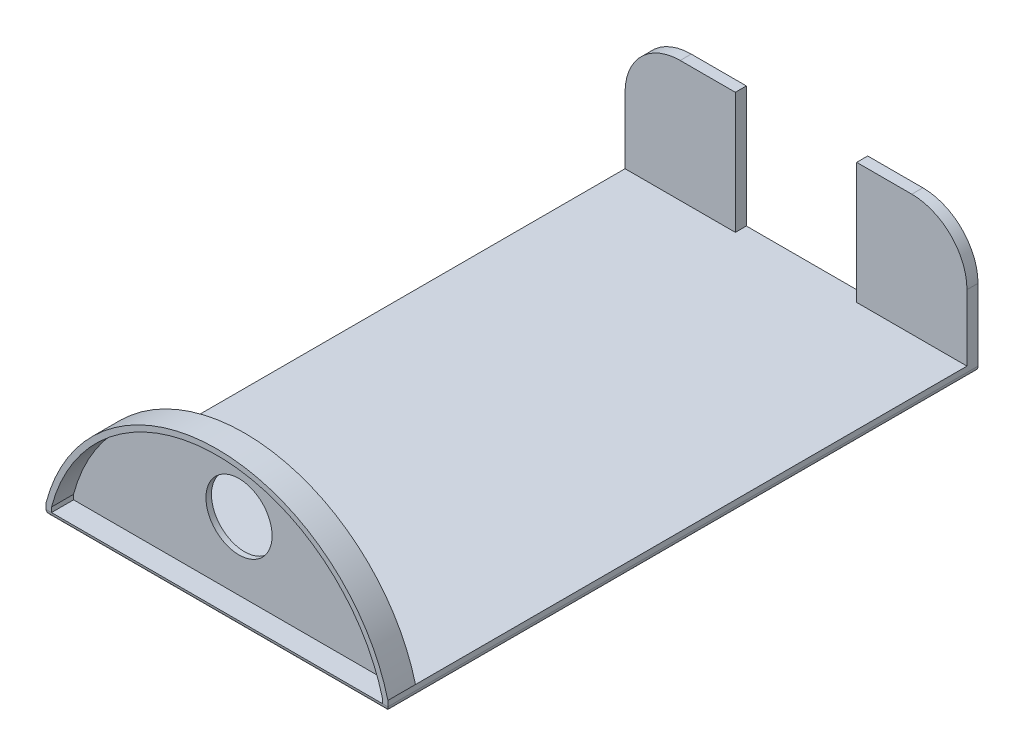
ISO-10303-21;
HEADER;
FILE_DESCRIPTION(('STEP AP214'),'2;1');
FILE_NAME('part.step','',(''),(''),'','','');
FILE_SCHEMA(('AUTOMOTIVE_DESIGN { 1 0 10303 214 1 1 1 1 }'));
ENDSEC;
DATA;
#1=APPLICATION_CONTEXT('core data for automotive mechanical design processes');
#2=APPLICATION_PROTOCOL_DEFINITION('international standard','automotive_design',2000,#1);
#3=PRODUCT_CONTEXT('',#1,'mechanical');
#4=PRODUCT('Part','Part','',(#3));
#5=PRODUCT_RELATED_PRODUCT_CATEGORY('part','',(#4));
#6=PRODUCT_DEFINITION_FORMATION('','',#4);
#7=PRODUCT_DEFINITION_CONTEXT('part definition',#1,'design');
#8=PRODUCT_DEFINITION('design','',#6,#7);
#9=PRODUCT_DEFINITION_SHAPE('','',#8);
#10=(LENGTH_UNIT() NAMED_UNIT(*) SI_UNIT(.MILLI.,.METRE.));
#11=(NAMED_UNIT(*) PLANE_ANGLE_UNIT() SI_UNIT($,.RADIAN.));
#12=(NAMED_UNIT(*) SI_UNIT($,.STERADIAN.) SOLID_ANGLE_UNIT());
#13=UNCERTAINTY_MEASURE_WITH_UNIT(LENGTH_MEASURE(1.E-05),#10,'distance_accuracy_value','');
#14=(GEOMETRIC_REPRESENTATION_CONTEXT(3) GLOBAL_UNCERTAINTY_ASSIGNED_CONTEXT((#13)) GLOBAL_UNIT_ASSIGNED_CONTEXT((#10,
#11,#12)) REPRESENTATION_CONTEXT('',''));
#15=CARTESIAN_POINT('',(0.,0.,0.));
#16=DIRECTION('',(0.,0.,1.));
#17=DIRECTION('',(1.,0.,0.));
#18=AXIS2_PLACEMENT_3D('',#15,#16,#17);
#19=CARTESIAN_POINT('',(31.,-6.02353153407739,107.));
#20=DIRECTION('',(0.,0.,-1.));
#21=DIRECTION('',(-1.,0.,0.));
#22=AXIS2_PLACEMENT_3D('',#19,#20,#21);
#23=PLANE('',#22);
#24=DIRECTION('',(0.,-1.,0.));
#25=VECTOR('',#24,1.);
#26=CARTESIAN_POINT('',(0.,2.,107.));
#27=LINE('',#26,#25);
#28=CARTESIAN_POINT('',(0.,2.,107.));
#29=VERTEX_POINT('',#28);
#30=CARTESIAN_POINT('',(0.,1.,107.));
#31=VERTEX_POINT('',#30);
#32=EDGE_CURVE('E212',#29,#31,#27,.T.);
#33=ORIENTED_EDGE('',*,*,#32,.T.);
#34=DIRECTION('',(1.,0.,0.));
#35=VECTOR('',#34,1.);
#36=CARTESIAN_POINT('',(31.,0.999999999999999,107.));
#37=LINE('',#36,#35);
#38=CARTESIAN_POINT('',(1.,1.,107.));
#39=VERTEX_POINT('',#38);
#40=EDGE_CURVE('E283',#31,#39,#37,.T.);
#41=ORIENTED_EDGE('',*,*,#40,.T.);
#42=DIRECTION('',(0.,-1.,0.));
#43=VECTOR('',#42,1.);
#44=CARTESIAN_POINT('',(1.,-6.02353153407739,107.));
#45=LINE('',#44,#43);
#46=CARTESIAN_POINT('',(1.,1.87165938603069,107.));
#47=VERTEX_POINT('',#46);
#48=EDGE_CURVE('E206',#47,#39,#45,.T.);
#49=ORIENTED_EDGE('',*,*,#48,.F.);
#50=CARTESIAN_POINT('',(31.,-6.02353153407739,107.));
#51=DIRECTION('',(0.,0.,-1.));
#52=DIRECTION('',(-1.,0.,0.));
#53=AXIS2_PLACEMENT_3D('',#50,#51,#52);
#54=CIRCLE('',#53,31.0215093066884);
#55=CARTESIAN_POINT('',(61.,1.87165938603069,107.));
#56=VERTEX_POINT('',#55);
#57=EDGE_CURVE('E173',#56,#47,#54,.F.);
#58=ORIENTED_EDGE('',*,*,#57,.F.);
#59=DIRECTION('',(0.,1.,0.));
#60=VECTOR('',#59,1.);
#61=CARTESIAN_POINT('',(61.,-6.02353153407739,107.));
#62=LINE('',#61,#60);
#63=CARTESIAN_POINT('',(61.,0.999999999999998,107.));
#64=VERTEX_POINT('',#63);
#65=EDGE_CURVE('E202',#64,#56,#62,.T.);
#66=ORIENTED_EDGE('',*,*,#65,.F.);
#67=DIRECTION('',(1.,0.,0.));
#68=VECTOR('',#67,1.);
#69=CARTESIAN_POINT('',(31.,0.999999999999999,107.));
#70=LINE('',#69,#68);
#71=CARTESIAN_POINT('',(62.,0.999999999999997,107.));
#72=VERTEX_POINT('',#71);
#73=EDGE_CURVE('E281',#64,#72,#70,.T.);
#74=ORIENTED_EDGE('',*,*,#73,.T.);
#75=DIRECTION('',(0.,1.,0.));
#76=VECTOR('',#75,1.);
#77=CARTESIAN_POINT('',(62.,0.,107.));
#78=LINE('',#77,#76);
#79=CARTESIAN_POINT('',(62.,2.,107.));
#80=VERTEX_POINT('',#79);
#81=EDGE_CURVE('E215',#72,#80,#78,.T.);
#82=ORIENTED_EDGE('',*,*,#81,.T.);
#83=CARTESIAN_POINT('',(31.,-6.02353153407739,107.));
#84=DIRECTION('',(0.,0.,1.));
#85=DIRECTION('',(-1.,0.,0.));
#86=AXIS2_PLACEMENT_3D('',#83,#84,#85);
#87=CIRCLE('',#86,32.0215093066884);
#88=EDGE_CURVE('E209',#80,#29,#87,.T.);
#89=ORIENTED_EDGE('',*,*,#88,.T.);
#90=EDGE_LOOP('',(#33,#41,#49,#58,#66,#74,#82,#89));
#91=FACE_BOUND('',#90,.T.);
#92=ADVANCED_FACE('F36',(#91),#23,.F.);
#93=CARTESIAN_POINT('',(0.,0.,2.));
#94=DIRECTION('',(0.,0.,-1.));
#95=DIRECTION('',(-1.,0.,0.));
#96=AXIS2_PLACEMENT_3D('',#93,#94,#95);
#97=PLANE('',#96);
#98=DIRECTION('',(0.,1.,0.));
#99=VECTOR('',#98,1.);
#100=CARTESIAN_POINT('',(62.,24.,2.));
#101=LINE('',#100,#99);
#102=CARTESIAN_POINT('',(62.,2.00000000000001,2.));
#103=VERTEX_POINT('',#102);
#104=CARTESIAN_POINT('',(62.,14.,2.));
#105=VERTEX_POINT('',#104);
#106=EDGE_CURVE('E239',#103,#105,#101,.T.);
#107=ORIENTED_EDGE('',*,*,#106,.T.);
#108=CARTESIAN_POINT('',(52.,14.,2.));
#109=DIRECTION('',(0.,0.,-1.));
#110=DIRECTION('',(-1.,0.,0.));
#111=AXIS2_PLACEMENT_3D('',#108,#109,#110);
#112=CIRCLE('',#111,10.);
#113=CARTESIAN_POINT('',(52.,24.,2.));
#114=VERTEX_POINT('',#113);
#115=EDGE_CURVE('E11',#105,#114,#112,.F.);
#116=ORIENTED_EDGE('',*,*,#115,.T.);
#117=DIRECTION('',(-1.,0.,0.));
#118=VECTOR('',#117,1.);
#119=CARTESIAN_POINT('',(42.,24.,2.));
#120=LINE('',#119,#118);
#121=CARTESIAN_POINT('',(42.,24.,2.));
#122=VERTEX_POINT('',#121);
#123=EDGE_CURVE('E241',#114,#122,#120,.T.);
#124=ORIENTED_EDGE('',*,*,#123,.T.);
#125=DIRECTION('',(0.,-1.,0.));
#126=VECTOR('',#125,1.);
#127=CARTESIAN_POINT('',(42.,2.,2.));
#128=LINE('',#127,#126);
#129=CARTESIAN_POINT('',(42.,2.,2.));
#130=VERTEX_POINT('',#129);
#131=EDGE_CURVE('E244',#122,#130,#128,.T.);
#132=ORIENTED_EDGE('',*,*,#131,.T.);
#133=DIRECTION('',(-1.,0.,0.));
#134=VECTOR('',#133,1.);
#135=CARTESIAN_POINT('',(0.,2.,2.));
#136=LINE('',#135,#134);
#137=EDGE_CURVE('E225',#103,#130,#136,.T.);
#138=ORIENTED_EDGE('',*,*,#137,.F.);
#139=EDGE_LOOP('',(#107,#116,#124,#132,#138));
#140=FACE_BOUND('',#139,.T.);
#141=ADVANCED_FACE('F342',(#140),#97,.F.);
#142=DIRECTION('',(-1.,0.,0.));
#143=VECTOR('',#142,1.);
#144=CARTESIAN_POINT('',(0.,24.,2.));
#145=LINE('',#144,#143);
#146=CARTESIAN_POINT('',(20.,24.,2.));
#147=VERTEX_POINT('',#146);
#148=CARTESIAN_POINT('',(10.,24.,2.));
#149=VERTEX_POINT('',#148);
#150=EDGE_CURVE('E248',#147,#149,#145,.T.);
#151=ORIENTED_EDGE('',*,*,#150,.T.);
#152=CARTESIAN_POINT('',(10.,14.,2.));
#153=DIRECTION('',(0.,0.,-1.));
#154=DIRECTION('',(-1.,0.,0.));
#155=AXIS2_PLACEMENT_3D('',#152,#153,#154);
#156=CIRCLE('',#155,10.);
#157=CARTESIAN_POINT('',(0.,14.,2.));
#158=VERTEX_POINT('',#157);
#159=EDGE_CURVE('E317',#149,#158,#156,.F.);
#160=ORIENTED_EDGE('',*,*,#159,.T.);
#161=DIRECTION('',(0.,-1.,0.));
#162=VECTOR('',#161,1.);
#163=CARTESIAN_POINT('',(0.,0.,2.));
#164=LINE('',#163,#162);
#165=CARTESIAN_POINT('',(0.,2.,2.));
#166=VERTEX_POINT('',#165);
#167=EDGE_CURVE('E251',#158,#166,#164,.T.);
#168=ORIENTED_EDGE('',*,*,#167,.T.);
#169=CARTESIAN_POINT('',(20.,2.,2.));
#170=VERTEX_POINT('',#169);
#171=EDGE_CURVE('E232',#170,#166,#136,.T.);
#172=ORIENTED_EDGE('',*,*,#171,.F.);
#173=DIRECTION('',(0.,1.,0.));
#174=VECTOR('',#173,1.);
#175=CARTESIAN_POINT('',(20.,24.,2.));
#176=LINE('',#175,#174);
#177=EDGE_CURVE('E246',#170,#147,#176,.T.);
#178=ORIENTED_EDGE('',*,*,#177,.T.);
#179=EDGE_LOOP('',(#151,#160,#168,#172,#178));
#180=FACE_BOUND('',#179,.T.);
#181=ADVANCED_FACE('F376',(#180),#97,.F.);
#182=CARTESIAN_POINT('',(62.,0.,2.));
#183=DIRECTION('',(0.,1.,0.));
#184=DIRECTION('',(-1.,0.,0.));
#185=AXIS2_PLACEMENT_3D('',#182,#183,#184);
#186=PLANE('',#185);
#187=DIRECTION('',(1.,0.,0.));
#188=VECTOR('',#187,1.);
#189=CARTESIAN_POINT('',(62.,0.,0.));
#190=LINE('',#189,#188);
#191=CARTESIAN_POINT('',(1.,0.,0.));
#192=VERTEX_POINT('',#191);
#193=CARTESIAN_POINT('',(61.,0.,0.));
#194=VERTEX_POINT('',#193);
#195=EDGE_CURVE('E238',#192,#194,#190,.T.);
#196=ORIENTED_EDGE('',*,*,#195,.T.);
#197=DIRECTION('',(0.,0.,-1.));
#198=VECTOR('',#197,1.);
#199=CARTESIAN_POINT('',(61.,0.,2.));
#200=LINE('',#199,#198);
#201=CARTESIAN_POINT('',(61.,0.,106.));
#202=VERTEX_POINT('',#201);
#203=EDGE_CURVE('E290',#194,#202,#200,.F.);
#204=ORIENTED_EDGE('',*,*,#203,.T.);
#205=DIRECTION('',(1.,0.,0.));
#206=VECTOR('',#205,1.);
#207=CARTESIAN_POINT('',(62.,0.,106.));
#208=LINE('',#207,#206);
#209=CARTESIAN_POINT('',(1.,0.,106.));
#210=VERTEX_POINT('',#209);
#211=EDGE_CURVE('E288',#202,#210,#208,.F.);
#212=ORIENTED_EDGE('',*,*,#211,.T.);
#213=DIRECTION('',(0.,0.,-1.));
#214=VECTOR('',#213,1.);
#215=CARTESIAN_POINT('',(1.,0.,2.));
#216=LINE('',#215,#214);
#217=EDGE_CURVE('E286',#210,#192,#216,.T.);
#218=ORIENTED_EDGE('',*,*,#217,.T.);
#219=EDGE_LOOP('',(#196,#204,#212,#218));
#220=FACE_BOUND('',#219,.T.);
#221=ADVANCED_FACE('F422',(#220),#186,.F.);
#222=CARTESIAN_POINT('',(62.,24.,2.));
#223=DIRECTION('',(-1.,0.,0.));
#224=DIRECTION('',(0.,-1.,0.));
#225=AXIS2_PLACEMENT_3D('',#222,#223,#224);
#226=PLANE('',#225);
#227=DIRECTION('',(0.,1.,0.));
#228=VECTOR('',#227,1.);
#229=CARTESIAN_POINT('',(62.,24.,0.));
#230=LINE('',#229,#228);
#231=CARTESIAN_POINT('',(62.,1.,0.));
#232=VERTEX_POINT('',#231);
#233=CARTESIAN_POINT('',(62.,14.,0.));
#234=VERTEX_POINT('',#233);
#235=EDGE_CURVE('E256',#232,#234,#230,.T.);
#236=ORIENTED_EDGE('',*,*,#235,.T.);
#237=DIRECTION('',(0.,0.,-1.));
#238=VECTOR('',#237,1.);
#239=CARTESIAN_POINT('',(62.,14.,2.));
#240=LINE('',#239,#238);
#241=EDGE_CURVE('E44',#234,#105,#240,.F.);
#242=ORIENTED_EDGE('',*,*,#241,.T.);
#243=ORIENTED_EDGE('',*,*,#106,.F.);
#244=DIRECTION('',(0.,0.,-1.));
#245=VECTOR('',#244,1.);
#246=CARTESIAN_POINT('',(62.,2.,102.));
#247=LINE('',#246,#245);
#248=CARTESIAN_POINT('',(62.,2.,102.));
#249=VERTEX_POINT('',#248);
#250=EDGE_CURVE('E235',#249,#103,#247,.T.);
#251=ORIENTED_EDGE('',*,*,#250,.F.);
#252=DIRECTION('',(0.,0.,-1.));
#253=VECTOR('',#252,1.);
#254=CARTESIAN_POINT('',(62.,2.,107.));
#255=LINE('',#254,#253);
#256=EDGE_CURVE('E217',#80,#249,#255,.T.);
#257=ORIENTED_EDGE('',*,*,#256,.F.);
#258=ORIENTED_EDGE('',*,*,#81,.F.);
#259=DIRECTION('',(0.,0.,-1.));
#260=VECTOR('',#259,1.);
#261=CARTESIAN_POINT('',(62.,0.999999999999997,2.));
#262=LINE('',#261,#260);
#263=EDGE_CURVE('E292',#72,#232,#262,.T.);
#264=ORIENTED_EDGE('',*,*,#263,.T.);
#265=EDGE_LOOP('',(#236,#242,#243,#251,#257,#258,#264));
#266=FACE_BOUND('',#265,.T.);
#267=ADVANCED_FACE('F343',(#266),#226,.F.);
#268=CARTESIAN_POINT('',(42.,24.,2.));
#269=DIRECTION('',(0.,-1.,0.));
#270=DIRECTION('',(0.,0.,-1.));
#271=AXIS2_PLACEMENT_3D('',#268,#269,#270);
#272=PLANE('',#271);
#273=ORIENTED_EDGE('',*,*,#123,.F.);
#274=DIRECTION('',(0.,0.,-1.));
#275=VECTOR('',#274,1.);
#276=CARTESIAN_POINT('',(52.,24.,2.));
#277=LINE('',#276,#275);
#278=CARTESIAN_POINT('',(52.,24.,0.));
#279=VERTEX_POINT('',#278);
#280=EDGE_CURVE('E319',#114,#279,#277,.T.);
#281=ORIENTED_EDGE('',*,*,#280,.T.);
#282=DIRECTION('',(-1.,0.,0.));
#283=VECTOR('',#282,1.);
#284=CARTESIAN_POINT('',(42.,24.,0.));
#285=LINE('',#284,#283);
#286=CARTESIAN_POINT('',(42.,24.,0.));
#287=VERTEX_POINT('',#286);
#288=EDGE_CURVE('E258',#279,#287,#285,.T.);
#289=ORIENTED_EDGE('',*,*,#288,.T.);
#290=DIRECTION('',(0.,0.,-1.));
#291=VECTOR('',#290,1.);
#292=CARTESIAN_POINT('',(42.,24.,2.));
#293=LINE('',#292,#291);
#294=EDGE_CURVE('E278',#122,#287,#293,.T.);
#295=ORIENTED_EDGE('',*,*,#294,.F.);
#296=EDGE_LOOP('',(#273,#281,#289,#295));
#297=FACE_BOUND('',#296,.T.);
#298=ADVANCED_FACE('F325',(#297),#272,.F.);
#299=CARTESIAN_POINT('',(42.,2.,2.));
#300=DIRECTION('',(1.,0.,0.));
#301=DIRECTION('',(0.,1.,0.));
#302=AXIS2_PLACEMENT_3D('',#299,#300,#301);
#303=PLANE('',#302);
#304=DIRECTION('',(0.,-1.,0.));
#305=VECTOR('',#304,1.);
#306=CARTESIAN_POINT('',(42.,2.,0.));
#307=LINE('',#306,#305);
#308=CARTESIAN_POINT('',(42.,2.,0.));
#309=VERTEX_POINT('',#308);
#310=EDGE_CURVE('E260',#287,#309,#307,.T.);
#311=ORIENTED_EDGE('',*,*,#310,.T.);
#312=DIRECTION('',(0.,0.,-1.));
#313=VECTOR('',#312,1.);
#314=CARTESIAN_POINT('',(42.,2.,2.));
#315=LINE('',#314,#313);
#316=EDGE_CURVE('E275',#130,#309,#315,.T.);
#317=ORIENTED_EDGE('',*,*,#316,.F.);
#318=ORIENTED_EDGE('',*,*,#131,.F.);
#319=ORIENTED_EDGE('',*,*,#294,.T.);
#320=EDGE_LOOP('',(#311,#317,#318,#319));
#321=FACE_BOUND('',#320,.T.);
#322=ADVANCED_FACE('F335',(#321),#303,.F.);
#323=CARTESIAN_POINT('',(20.,2.,2.));
#324=DIRECTION('',(0.,-1.,0.));
#325=DIRECTION('',(0.,0.,-1.));
#326=AXIS2_PLACEMENT_3D('',#323,#324,#325);
#327=PLANE('',#326);
#328=DIRECTION('',(-1.,0.,0.));
#329=VECTOR('',#328,1.);
#330=CARTESIAN_POINT('',(20.,2.,0.));
#331=LINE('',#330,#329);
#332=CARTESIAN_POINT('',(20.,2.,0.));
#333=VERTEX_POINT('',#332);
#334=EDGE_CURVE('E262',#309,#333,#331,.T.);
#335=ORIENTED_EDGE('',*,*,#334,.T.);
#336=DIRECTION('',(0.,0.,-1.));
#337=VECTOR('',#336,1.);
#338=CARTESIAN_POINT('',(20.,2.,2.));
#339=LINE('',#338,#337);
#340=EDGE_CURVE('E272',#170,#333,#339,.T.);
#341=ORIENTED_EDGE('',*,*,#340,.F.);
#342=ORIENTED_EDGE('',*,*,#171,.T.);
#343=DIRECTION('',(0.,0.,-1.));
#344=VECTOR('',#343,1.);
#345=CARTESIAN_POINT('',(0.,2.,102.));
#346=LINE('',#345,#344);
#347=CARTESIAN_POINT('',(0.,2.,102.));
#348=VERTEX_POINT('',#347);
#349=EDGE_CURVE('E229',#348,#166,#346,.T.);
#350=ORIENTED_EDGE('',*,*,#349,.F.);
#351=DIRECTION('',(-1.,0.,0.));
#352=VECTOR('',#351,1.);
#353=CARTESIAN_POINT('',(0.,2.,102.));
#354=LINE('',#353,#352);
#355=EDGE_CURVE('E226',#249,#348,#354,.T.);
#356=ORIENTED_EDGE('',*,*,#355,.F.);
#357=ORIENTED_EDGE('',*,*,#250,.T.);
#358=ORIENTED_EDGE('',*,*,#137,.T.);
#359=ORIENTED_EDGE('',*,*,#316,.T.);
#360=EDGE_LOOP('',(#335,#341,#342,#350,#356,#357,#358,#359));
#361=FACE_BOUND('',#360,.T.);
#362=ADVANCED_FACE('F338',(#361),#327,.F.);
#363=CARTESIAN_POINT('',(20.,24.,2.));
#364=DIRECTION('',(-1.,0.,0.));
#365=DIRECTION('',(0.,-1.,0.));
#366=AXIS2_PLACEMENT_3D('',#363,#364,#365);
#367=PLANE('',#366);
#368=DIRECTION('',(0.,1.,0.));
#369=VECTOR('',#368,1.);
#370=CARTESIAN_POINT('',(20.,24.,0.));
#371=LINE('',#370,#369);
#372=CARTESIAN_POINT('',(20.,24.,0.));
#373=VERTEX_POINT('',#372);
#374=EDGE_CURVE('E264',#333,#373,#371,.T.);
#375=ORIENTED_EDGE('',*,*,#374,.T.);
#376=DIRECTION('',(0.,0.,-1.));
#377=VECTOR('',#376,1.);
#378=CARTESIAN_POINT('',(20.,24.,2.));
#379=LINE('',#378,#377);
#380=EDGE_CURVE('E253',#147,#373,#379,.T.);
#381=ORIENTED_EDGE('',*,*,#380,.F.);
#382=ORIENTED_EDGE('',*,*,#177,.F.);
#383=ORIENTED_EDGE('',*,*,#340,.T.);
#384=EDGE_LOOP('',(#375,#381,#382,#383));
#385=FACE_BOUND('',#384,.T.);
#386=ADVANCED_FACE('F441',(#385),#367,.F.);
#387=CARTESIAN_POINT('',(0.,24.,2.));
#388=DIRECTION('',(0.,-1.,0.));
#389=DIRECTION('',(0.,0.,-1.));
#390=AXIS2_PLACEMENT_3D('',#387,#388,#389);
#391=PLANE('',#390);
#392=DIRECTION('',(-1.,0.,0.));
#393=VECTOR('',#392,1.);
#394=CARTESIAN_POINT('',(0.,24.,0.));
#395=LINE('',#394,#393);
#396=CARTESIAN_POINT('',(10.,24.,0.));
#397=VERTEX_POINT('',#396);
#398=EDGE_CURVE('E266',#373,#397,#395,.T.);
#399=ORIENTED_EDGE('',*,*,#398,.T.);
#400=DIRECTION('',(0.,0.,-1.));
#401=VECTOR('',#400,1.);
#402=CARTESIAN_POINT('',(10.,24.,2.));
#403=LINE('',#402,#401);
#404=EDGE_CURVE('E315',#397,#149,#403,.F.);
#405=ORIENTED_EDGE('',*,*,#404,.T.);
#406=ORIENTED_EDGE('',*,*,#150,.F.);
#407=ORIENTED_EDGE('',*,*,#380,.T.);
#408=EDGE_LOOP('',(#399,#405,#406,#407));
#409=FACE_BOUND('',#408,.T.);
#410=ADVANCED_FACE('F436',(#409),#391,.F.);
#411=CARTESIAN_POINT('',(0.,0.,2.));
#412=DIRECTION('',(1.,0.,0.));
#413=DIRECTION('',(0.,0.,-1.));
#414=AXIS2_PLACEMENT_3D('',#411,#412,#413);
#415=PLANE('',#414);
#416=ORIENTED_EDGE('',*,*,#167,.F.);
#417=DIRECTION('',(0.,0.,-1.));
#418=VECTOR('',#417,1.);
#419=CARTESIAN_POINT('',(0.,14.,2.));
#420=LINE('',#419,#418);
#421=CARTESIAN_POINT('',(0.,14.,0.));
#422=VERTEX_POINT('',#421);
#423=EDGE_CURVE('E301',#158,#422,#420,.T.);
#424=ORIENTED_EDGE('',*,*,#423,.T.);
#425=DIRECTION('',(0.,-1.,0.));
#426=VECTOR('',#425,1.);
#427=CARTESIAN_POINT('',(0.,0.,0.));
#428=LINE('',#427,#426);
#429=CARTESIAN_POINT('',(0.,1.,0.));
#430=VERTEX_POINT('',#429);
#431=EDGE_CURVE('E242',#422,#430,#428,.T.);
#432=ORIENTED_EDGE('',*,*,#431,.T.);
#433=DIRECTION('',(0.,0.,-1.));
#434=VECTOR('',#433,1.);
#435=CARTESIAN_POINT('',(0.,1.,2.));
#436=LINE('',#435,#434);
#437=EDGE_CURVE('E299',#430,#31,#436,.F.);
#438=ORIENTED_EDGE('',*,*,#437,.T.);
#439=ORIENTED_EDGE('',*,*,#32,.F.);
#440=DIRECTION('',(0.,0.,-1.));
#441=VECTOR('',#440,1.);
#442=CARTESIAN_POINT('',(0.,2.,107.));
#443=LINE('',#442,#441);
#444=EDGE_CURVE('E222',#29,#348,#443,.T.);
#445=ORIENTED_EDGE('',*,*,#444,.T.);
#446=ORIENTED_EDGE('',*,*,#349,.T.);
#447=EDGE_LOOP('',(#416,#424,#432,#438,#439,#445,#446));
#448=FACE_BOUND('',#447,.T.);
#449=ADVANCED_FACE('F430',(#448),#415,.F.);
#450=CARTESIAN_POINT('',(0.,0.,0.));
#451=DIRECTION('',(0.,0.,-1.));
#452=DIRECTION('',(-1.,0.,0.));
#453=AXIS2_PLACEMENT_3D('',#450,#451,#452);
#454=PLANE('',#453);
#455=ORIENTED_EDGE('',*,*,#288,.F.);
#456=CARTESIAN_POINT('',(52.,14.,0.));
#457=DIRECTION('',(0.,0.,-1.));
#458=DIRECTION('',(-1.,0.,0.));
#459=AXIS2_PLACEMENT_3D('',#456,#457,#458);
#460=CIRCLE('',#459,10.);
#461=EDGE_CURVE('E58',#279,#234,#460,.T.);
#462=ORIENTED_EDGE('',*,*,#461,.T.);
#463=ORIENTED_EDGE('',*,*,#235,.F.);
#464=CARTESIAN_POINT('',(61.,0.999999999999997,0.));
#465=DIRECTION('',(0.,0.,-1.));
#466=DIRECTION('',(-1.,0.,0.));
#467=AXIS2_PLACEMENT_3D('',#464,#465,#466);
#468=CIRCLE('',#467,1.);
#469=EDGE_CURVE('E297',#232,#194,#468,.T.);
#470=ORIENTED_EDGE('',*,*,#469,.T.);
#471=ORIENTED_EDGE('',*,*,#195,.F.);
#472=CARTESIAN_POINT('',(1.,1.,0.));
#473=DIRECTION('',(0.,0.,-1.));
#474=DIRECTION('',(-1.,0.,0.));
#475=AXIS2_PLACEMENT_3D('',#472,#473,#474);
#476=CIRCLE('',#475,1.);
#477=EDGE_CURVE('E294',#192,#430,#476,.T.);
#478=ORIENTED_EDGE('',*,*,#477,.T.);
#479=ORIENTED_EDGE('',*,*,#431,.F.);
#480=CARTESIAN_POINT('',(10.,14.,0.));
#481=DIRECTION('',(0.,0.,-1.));
#482=DIRECTION('',(-1.,0.,0.));
#483=AXIS2_PLACEMENT_3D('',#480,#481,#482);
#484=CIRCLE('',#483,10.);
#485=EDGE_CURVE('E313',#422,#397,#484,.T.);
#486=ORIENTED_EDGE('',*,*,#485,.T.);
#487=ORIENTED_EDGE('',*,*,#398,.F.);
#488=ORIENTED_EDGE('',*,*,#374,.F.);
#489=ORIENTED_EDGE('',*,*,#334,.F.);
#490=ORIENTED_EDGE('',*,*,#310,.F.);
#491=EDGE_LOOP('',(#455,#462,#463,#470,#471,#478,#479,#486,#487,#488,#489,#490));
#492=FACE_BOUND('',#491,.T.);
#493=ADVANCED_FACE('F330',(#492),#454,.T.);
#494=CARTESIAN_POINT('',(31.,-6.02353153407739,107.));
#495=DIRECTION('',(0.,0.,-1.));
#496=DIRECTION('',(-1.,0.,0.));
#497=AXIS2_PLACEMENT_3D('',#494,#495,#496);
#498=CYLINDRICAL_SURFACE('',#497,32.0215093066884);
#499=CARTESIAN_POINT('',(31.,-6.02353153407739,102.));
#500=DIRECTION('',(0.,0.,1.));
#501=DIRECTION('',(-1.,0.,0.));
#502=AXIS2_PLACEMENT_3D('',#499,#500,#501);
#503=CIRCLE('',#502,32.0215093066884);
#504=EDGE_CURVE('E196',#249,#348,#503,.T.);
#505=ORIENTED_EDGE('',*,*,#504,.T.);
#506=ORIENTED_EDGE('',*,*,#444,.F.);
#507=ORIENTED_EDGE('',*,*,#88,.F.);
#508=ORIENTED_EDGE('',*,*,#256,.T.);
#509=EDGE_LOOP('',(#505,#506,#507,#508));
#510=FACE_BOUND('',#509,.T.);
#511=ADVANCED_FACE('F351',(#510),#498,.T.);
#512=CARTESIAN_POINT('',(31.,-6.02353153407739,102.));
#513=DIRECTION('',(0.,0.,-1.));
#514=DIRECTION('',(-1.,0.,0.));
#515=AXIS2_PLACEMENT_3D('',#512,#513,#514);
#516=PLANE('',#515);
#517=CARTESIAN_POINT('',(31.,13.3434581379809,102.));
#518=DIRECTION('',(0.,0.,-1.));
#519=DIRECTION('',(-1.,0.,0.));
#520=AXIS2_PLACEMENT_3D('',#517,#518,#519);
#521=CIRCLE('',#520,6.00000000000001);
#522=CARTESIAN_POINT('',(25.,13.3434581379809,102.));
#523=VERTEX_POINT('',#522);
#524=EDGE_CURVE('E305',#523,#523,#521,.T.);
#525=ORIENTED_EDGE('',*,*,#524,.F.);
#526=EDGE_LOOP('',(#525));
#527=FACE_BOUND('',#526,.T.);
#528=ORIENTED_EDGE('',*,*,#504,.F.);
#529=ORIENTED_EDGE('',*,*,#355,.T.);
#530=EDGE_LOOP('',(#528,#529));
#531=FACE_BOUND('',#530,.T.);
#532=ADVANCED_FACE('F353',(#527,#531),#516,.T.);
#533=CARTESIAN_POINT('',(62.,0.999999999999998,2.));
#534=DIRECTION('',(0.,1.,0.));
#535=DIRECTION('',(-1.,0.,0.));
#536=AXIS2_PLACEMENT_3D('',#533,#534,#535);
#537=PLANE('',#536);
#538=DIRECTION('',(0.,0.,-1.));
#539=VECTOR('',#538,1.);
#540=CARTESIAN_POINT('',(1.,1.,2.));
#541=LINE('',#540,#539);
#542=CARTESIAN_POINT('',(1.,1.,103.));
#543=VERTEX_POINT('',#542);
#544=EDGE_CURVE('E193',#39,#543,#541,.T.);
#545=ORIENTED_EDGE('',*,*,#544,.F.);
#546=DIRECTION('',(1.,0.,0.));
#547=VECTOR('',#546,1.);
#548=CARTESIAN_POINT('',(31.,0.999999999999999,107.));
#549=LINE('',#548,#547);
#550=EDGE_CURVE('E204',#39,#64,#549,.T.);
#551=ORIENTED_EDGE('',*,*,#550,.T.);
#552=DIRECTION('',(0.,0.,-1.));
#553=VECTOR('',#552,1.);
#554=CARTESIAN_POINT('',(61.,0.999999999999997,2.));
#555=LINE('',#554,#553);
#556=CARTESIAN_POINT('',(61.,1.,103.));
#557=VERTEX_POINT('',#556);
#558=EDGE_CURVE('E194',#64,#557,#555,.T.);
#559=ORIENTED_EDGE('',*,*,#558,.T.);
#560=DIRECTION('',(-1.,0.,0.));
#561=VECTOR('',#560,1.);
#562=CARTESIAN_POINT('',(31.,1.,103.));
#563=LINE('',#562,#561);
#564=EDGE_CURVE('E178',#557,#543,#563,.T.);
#565=ORIENTED_EDGE('',*,*,#564,.T.);
#566=EDGE_LOOP('',(#545,#551,#559,#565));
#567=FACE_BOUND('',#566,.T.);
#568=ADVANCED_FACE('F355',(#567),#537,.T.);
#569=CARTESIAN_POINT('',(61.,24.,2.));
#570=DIRECTION('',(-1.,0.,0.));
#571=DIRECTION('',(0.,-1.,0.));
#572=AXIS2_PLACEMENT_3D('',#569,#570,#571);
#573=PLANE('',#572);
#574=ORIENTED_EDGE('',*,*,#558,.F.);
#575=ORIENTED_EDGE('',*,*,#65,.T.);
#576=DIRECTION('',(0.,0.,-1.));
#577=VECTOR('',#576,1.);
#578=CARTESIAN_POINT('',(61.,1.87165938603069,107.));
#579=LINE('',#578,#577);
#580=CARTESIAN_POINT('',(61.,1.8716593860307,103.));
#581=VERTEX_POINT('',#580);
#582=EDGE_CURVE('E179',#56,#581,#579,.T.);
#583=ORIENTED_EDGE('',*,*,#582,.T.);
#584=DIRECTION('',(0.,1.,0.));
#585=VECTOR('',#584,1.);
#586=CARTESIAN_POINT('',(61.,-6.02353153407739,103.));
#587=LINE('',#586,#585);
#588=EDGE_CURVE('E187',#557,#581,#587,.T.);
#589=ORIENTED_EDGE('',*,*,#588,.F.);
#590=EDGE_LOOP('',(#574,#575,#583,#589));
#591=FACE_BOUND('',#590,.T.);
#592=ADVANCED_FACE('F363',(#591),#573,.T.);
#593=CARTESIAN_POINT('',(1.,0.,2.));
#594=DIRECTION('',(1.,0.,0.));
#595=DIRECTION('',(0.,0.,-1.));
#596=AXIS2_PLACEMENT_3D('',#593,#594,#595);
#597=PLANE('',#596);
#598=DIRECTION('',(0.,1.,0.));
#599=VECTOR('',#598,1.);
#600=CARTESIAN_POINT('',(1.,0.,103.));
#601=LINE('',#600,#599);
#602=CARTESIAN_POINT('',(1.,1.8716593860307,103.));
#603=VERTEX_POINT('',#602);
#604=EDGE_CURVE('E185',#543,#603,#601,.T.);
#605=ORIENTED_EDGE('',*,*,#604,.T.);
#606=DIRECTION('',(0.,0.,-1.));
#607=VECTOR('',#606,1.);
#608=CARTESIAN_POINT('',(1.,1.8716593860307,107.));
#609=LINE('',#608,#607);
#610=EDGE_CURVE('E166',#47,#603,#609,.T.);
#611=ORIENTED_EDGE('',*,*,#610,.F.);
#612=ORIENTED_EDGE('',*,*,#48,.T.);
#613=ORIENTED_EDGE('',*,*,#544,.T.);
#614=EDGE_LOOP('',(#605,#611,#612,#613));
#615=FACE_BOUND('',#614,.T.);
#616=ADVANCED_FACE('F191',(#615),#597,.T.);
#617=CARTESIAN_POINT('',(31.,-6.02353153407739,107.));
#618=DIRECTION('',(0.,0.,-1.));
#619=DIRECTION('',(-1.,0.,0.));
#620=AXIS2_PLACEMENT_3D('',#617,#618,#619);
#621=CYLINDRICAL_SURFACE('',#620,31.0215093066884);
#622=CARTESIAN_POINT('',(31.,-6.02353153407739,103.));
#623=DIRECTION('',(0.,0.,-1.));
#624=DIRECTION('',(-1.,0.,0.));
#625=AXIS2_PLACEMENT_3D('',#622,#623,#624);
#626=CIRCLE('',#625,31.0215093066884);
#627=EDGE_CURVE('E170',#581,#603,#626,.F.);
#628=ORIENTED_EDGE('',*,*,#627,.F.);
#629=ORIENTED_EDGE('',*,*,#582,.F.);
#630=ORIENTED_EDGE('',*,*,#57,.T.);
#631=ORIENTED_EDGE('',*,*,#610,.T.);
#632=EDGE_LOOP('',(#628,#629,#630,#631));
#633=FACE_BOUND('',#632,.T.);
#634=ADVANCED_FACE('F168',(#633),#621,.F.);
#635=CARTESIAN_POINT('',(31.,-6.02353153407739,103.));
#636=DIRECTION('',(0.,0.,-1.));
#637=DIRECTION('',(-1.,0.,0.));
#638=AXIS2_PLACEMENT_3D('',#635,#636,#637);
#639=PLANE('',#638);
#640=CARTESIAN_POINT('',(31.,13.3434581379809,103.));
#641=DIRECTION('',(0.,0.,1.));
#642=DIRECTION('',(1.,0.,0.));
#643=AXIS2_PLACEMENT_3D('',#640,#641,#642);
#644=CIRCLE('',#643,6.00000000000001);
#645=CARTESIAN_POINT('',(37.,13.3434581379809,103.));
#646=VERTEX_POINT('',#645);
#647=EDGE_CURVE('E310',#646,#646,#644,.T.);
#648=ORIENTED_EDGE('',*,*,#647,.F.);
#649=EDGE_LOOP('',(#648));
#650=FACE_BOUND('',#649,.T.);
#651=ORIENTED_EDGE('',*,*,#627,.T.);
#652=ORIENTED_EDGE('',*,*,#604,.F.);
#653=ORIENTED_EDGE('',*,*,#564,.F.);
#654=ORIENTED_EDGE('',*,*,#588,.T.);
#655=EDGE_LOOP('',(#651,#652,#653,#654));
#656=FACE_BOUND('',#655,.T.);
#657=ADVANCED_FACE('F184',(#650,#656),#639,.F.);
#658=CARTESIAN_POINT('',(1.,1.,2.));
#659=DIRECTION('',(0.,0.,-1.));
#660=DIRECTION('',(-1.,0.,0.));
#661=AXIS2_PLACEMENT_3D('',#658,#659,#660);
#662=CYLINDRICAL_SURFACE('',#661,1.);
#663=ORIENTED_EDGE('',*,*,#477,.F.);
#664=ORIENTED_EDGE('',*,*,#217,.F.);
#665=CARTESIAN_POINT('',(1.,1.,106.));
#666=DIRECTION('',(-0.707106781186547,0.,-0.707106781186547));
#667=DIRECTION('',(0.707106781186547,0.,-0.707106781186547));
#668=AXIS2_PLACEMENT_3D('',#665,#666,#667);
#669=ELLIPSE('',#668,1.41421356237309,1.);
#670=EDGE_CURVE('E188',#31,#210,#669,.F.);
#671=ORIENTED_EDGE('',*,*,#670,.F.);
#672=ORIENTED_EDGE('',*,*,#437,.F.);
#673=EDGE_LOOP('',(#663,#664,#671,#672));
#674=FACE_BOUND('',#673,.T.);
#675=ADVANCED_FACE('F380',(#674),#662,.T.);
#676=CARTESIAN_POINT('',(61.,0.999999999999997,2.));
#677=DIRECTION('',(0.,0.,-1.));
#678=DIRECTION('',(-1.,0.,0.));
#679=AXIS2_PLACEMENT_3D('',#676,#677,#678);
#680=CYLINDRICAL_SURFACE('',#679,1.);
#681=ORIENTED_EDGE('',*,*,#469,.F.);
#682=ORIENTED_EDGE('',*,*,#263,.F.);
#683=CARTESIAN_POINT('',(61.,0.999999999999998,106.));
#684=DIRECTION('',(0.707106781186547,0.,-0.707106781186547));
#685=DIRECTION('',(-0.707106781186547,0.,-0.707106781186547));
#686=AXIS2_PLACEMENT_3D('',#683,#684,#685);
#687=ELLIPSE('',#686,1.41421356237309,1.);
#688=EDGE_CURVE('E302',#202,#72,#687,.F.);
#689=ORIENTED_EDGE('',*,*,#688,.F.);
#690=ORIENTED_EDGE('',*,*,#203,.F.);
#691=EDGE_LOOP('',(#681,#682,#689,#690));
#692=FACE_BOUND('',#691,.T.);
#693=ADVANCED_FACE('F399',(#692),#680,.T.);
#694=CARTESIAN_POINT('',(31.,0.999999999999999,106.));
#695=DIRECTION('',(1.,0.,0.));
#696=DIRECTION('',(0.,1.,0.));
#697=AXIS2_PLACEMENT_3D('',#694,#695,#696);
#698=CYLINDRICAL_SURFACE('',#697,1.);
#699=ORIENTED_EDGE('',*,*,#670,.T.);
#700=ORIENTED_EDGE('',*,*,#211,.F.);
#701=ORIENTED_EDGE('',*,*,#688,.T.);
#702=ORIENTED_EDGE('',*,*,#73,.F.);
#703=ORIENTED_EDGE('',*,*,#550,.F.);
#704=ORIENTED_EDGE('',*,*,#40,.F.);
#705=EDGE_LOOP('',(#699,#700,#701,#702,#703,#704));
#706=FACE_BOUND('',#705,.T.);
#707=ADVANCED_FACE('F392',(#706),#698,.T.);
#708=CARTESIAN_POINT('',(31.,13.3434581379809,101.));
#709=DIRECTION('',(0.,0.,1.));
#710=DIRECTION('',(1.,0.,0.));
#711=AXIS2_PLACEMENT_3D('',#708,#709,#710);
#712=CYLINDRICAL_SURFACE('',#711,6.00000000000001);
#713=ORIENTED_EDGE('',*,*,#524,.T.);
#714=EDGE_LOOP('',(#713));
#715=FACE_BOUND('',#714,.T.);
#716=ORIENTED_EDGE('',*,*,#647,.T.);
#717=EDGE_LOOP('',(#716));
#718=FACE_BOUND('',#717,.T.);
#719=ADVANCED_FACE('F389',(#715,#718),#712,.F.);
#720=CARTESIAN_POINT('',(10.,14.,2.));
#721=DIRECTION('',(0.,0.,-1.));
#722=DIRECTION('',(-1.,0.,0.));
#723=AXIS2_PLACEMENT_3D('',#720,#721,#722);
#724=CYLINDRICAL_SURFACE('',#723,10.);
#725=ORIENTED_EDGE('',*,*,#159,.F.);
#726=ORIENTED_EDGE('',*,*,#404,.F.);
#727=ORIENTED_EDGE('',*,*,#485,.F.);
#728=ORIENTED_EDGE('',*,*,#423,.F.);
#729=EDGE_LOOP('',(#725,#726,#727,#728));
#730=FACE_BOUND('',#729,.T.);
#731=ADVANCED_FACE('F391',(#730),#724,.T.);
#732=CARTESIAN_POINT('',(52.,14.,2.));
#733=DIRECTION('',(0.,0.,-1.));
#734=DIRECTION('',(-1.,0.,0.));
#735=AXIS2_PLACEMENT_3D('',#732,#733,#734);
#736=CYLINDRICAL_SURFACE('',#735,10.);
#737=ORIENTED_EDGE('',*,*,#115,.F.);
#738=ORIENTED_EDGE('',*,*,#241,.F.);
#739=ORIENTED_EDGE('',*,*,#461,.F.);
#740=ORIENTED_EDGE('',*,*,#280,.F.);
#741=EDGE_LOOP('',(#737,#738,#739,#740));
#742=FACE_BOUND('',#741,.T.);
#743=ADVANCED_FACE('F38',(#742),#736,.T.);
#744=CLOSED_SHELL('',(#92,#141,#181,#221,#267,#298,#322,#362,#386,#410,#449,#493,#511,#532,#568,
#592,#616,#634,#657,#675,#693,#707,#719,#731,#743));
#745=MANIFOLD_SOLID_BREP('B2',#744);
#746=ADVANCED_BREP_SHAPE_REPRESENTATION('',(#18,#745),#14);
#747=SHAPE_DEFINITION_REPRESENTATION(#9,#746);
ENDSEC;
END-ISO-10303-21;
